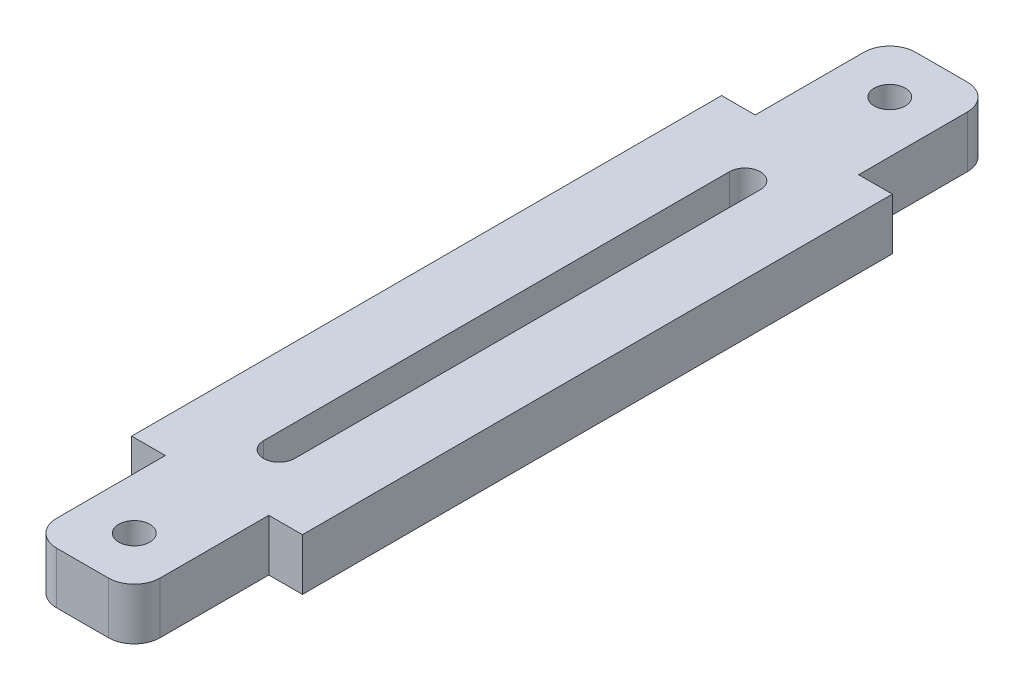
ISO-10303-21;
HEADER;
FILE_DESCRIPTION(('STEP AP214'),'2;1');
FILE_NAME('part.step','',(''),(''),'','','');
FILE_SCHEMA(('AUTOMOTIVE_DESIGN { 1 0 10303 214 1 1 1 1 }'));
ENDSEC;
DATA;
#1=APPLICATION_CONTEXT('core data for automotive mechanical design processes');
#2=APPLICATION_PROTOCOL_DEFINITION('international standard','automotive_design',2000,#1);
#3=PRODUCT_CONTEXT('',#1,'mechanical');
#4=PRODUCT('Part','Part','',(#3));
#5=PRODUCT_RELATED_PRODUCT_CATEGORY('part','',(#4));
#6=PRODUCT_DEFINITION_FORMATION('','',#4);
#7=PRODUCT_DEFINITION_CONTEXT('part definition',#1,'design');
#8=PRODUCT_DEFINITION('design','',#6,#7);
#9=PRODUCT_DEFINITION_SHAPE('','',#8);
#10=(LENGTH_UNIT() NAMED_UNIT(*) SI_UNIT(.MILLI.,.METRE.));
#11=(NAMED_UNIT(*) PLANE_ANGLE_UNIT() SI_UNIT($,.RADIAN.));
#12=(NAMED_UNIT(*) SI_UNIT($,.STERADIAN.) SOLID_ANGLE_UNIT());
#13=UNCERTAINTY_MEASURE_WITH_UNIT(LENGTH_MEASURE(1.E-05),#10,'distance_accuracy_value','');
#14=(GEOMETRIC_REPRESENTATION_CONTEXT(3) GLOBAL_UNCERTAINTY_ASSIGNED_CONTEXT((#13)) GLOBAL_UNIT_ASSIGNED_CONTEXT((#10,
#11,#12)) REPRESENTATION_CONTEXT('',''));
#15=CARTESIAN_POINT('',(0.,0.,0.));
#16=DIRECTION('',(0.,0.,1.));
#17=DIRECTION('',(1.,0.,0.));
#18=AXIS2_PLACEMENT_3D('',#15,#16,#17);
#19=CARTESIAN_POINT('',(0.,5.,0.));
#20=DIRECTION('',(0.,1.,0.));
#21=DIRECTION('',(0.,0.,1.));
#22=AXIS2_PLACEMENT_3D('',#19,#20,#21);
#23=PLANE('',#22);
#24=DIRECTION('',(0.,0.,-1.));
#25=VECTOR('',#24,1.);
#26=CARTESIAN_POINT('',(-1.5,5.,22.5));
#27=LINE('',#26,#25);
#28=CARTESIAN_POINT('',(-1.50000000000001,5.,-22.5));
#29=VERTEX_POINT('',#28);
#30=CARTESIAN_POINT('',(-1.5,5.,22.5));
#31=VERTEX_POINT('',#30);
#32=EDGE_CURVE('E168',#29,#31,#27,.F.);
#33=ORIENTED_EDGE('',*,*,#32,.F.);
#34=CARTESIAN_POINT('',(0.,5.,-22.5));
#35=DIRECTION('',(0.,-1.,0.));
#36=DIRECTION('',(0.,0.,-1.));
#37=AXIS2_PLACEMENT_3D('',#34,#35,#36);
#38=CIRCLE('',#37,1.5);
#39=CARTESIAN_POINT('',(1.49999999999999,5.,-22.5));
#40=VERTEX_POINT('',#39);
#41=EDGE_CURVE('E175',#29,#40,#38,.T.);
#42=ORIENTED_EDGE('',*,*,#41,.T.);
#43=DIRECTION('',(0.,0.,1.));
#44=VECTOR('',#43,1.);
#45=CARTESIAN_POINT('',(1.5,5.,22.5));
#46=LINE('',#45,#44);
#47=CARTESIAN_POINT('',(1.5,5.,22.5));
#48=VERTEX_POINT('',#47);
#49=EDGE_CURVE('E172',#48,#40,#46,.F.);
#50=ORIENTED_EDGE('',*,*,#49,.F.);
#51=CARTESIAN_POINT('',(0.,5.,22.5));
#52=DIRECTION('',(0.,-1.,0.));
#53=DIRECTION('',(0.,0.,-1.));
#54=AXIS2_PLACEMENT_3D('',#51,#52,#53);
#55=CIRCLE('',#54,1.5);
#56=EDGE_CURVE('E259',#48,#31,#55,.T.);
#57=ORIENTED_EDGE('',*,*,#56,.T.);
#58=EDGE_LOOP('',(#33,#42,#50,#57));
#59=FACE_BOUND('',#58,.T.);
#60=CARTESIAN_POINT('',(0.,5.,36.5));
#61=DIRECTION('',(0.,-1.,0.));
#62=DIRECTION('',(0.,0.,-1.));
#63=AXIS2_PLACEMENT_3D('',#60,#61,#62);
#64=CIRCLE('',#63,1.5);
#65=CARTESIAN_POINT('',(0.,5.,35.));
#66=VERTEX_POINT('',#65);
#67=EDGE_CURVE('E171',#66,#66,#64,.T.);
#68=ORIENTED_EDGE('',*,*,#67,.T.);
#69=EDGE_LOOP('',(#68));
#70=FACE_BOUND('',#69,.T.);
#71=DIRECTION('',(0.,0.,1.));
#72=VECTOR('',#71,1.);
#73=CARTESIAN_POINT('',(5.,5.,-41.5));
#74=LINE('',#73,#72);
#75=CARTESIAN_POINT('',(5.,5.,-28.5));
#76=VERTEX_POINT('',#75);
#77=CARTESIAN_POINT('',(5.,5.,-39.));
#78=VERTEX_POINT('',#77);
#79=EDGE_CURVE('E187',#76,#78,#74,.F.);
#80=ORIENTED_EDGE('',*,*,#79,.T.);
#81=CARTESIAN_POINT('',(2.5,5.,-39.));
#82=DIRECTION('',(0.,-1.,0.));
#83=DIRECTION('',(0.,0.,-1.));
#84=AXIS2_PLACEMENT_3D('',#81,#82,#83);
#85=CIRCLE('',#84,2.5);
#86=CARTESIAN_POINT('',(2.5,5.,-41.5));
#87=VERTEX_POINT('',#86);
#88=EDGE_CURVE('E189',#87,#78,#85,.T.);
#89=ORIENTED_EDGE('',*,*,#88,.F.);
#90=DIRECTION('',(1.,0.,0.));
#91=VECTOR('',#90,1.);
#92=CARTESIAN_POINT('',(-4.99999999999999,5.,-41.5));
#93=LINE('',#92,#91);
#94=CARTESIAN_POINT('',(-2.5,5.,-41.5));
#95=VERTEX_POINT('',#94);
#96=EDGE_CURVE('E182',#87,#95,#93,.F.);
#97=ORIENTED_EDGE('',*,*,#96,.T.);
#98=CARTESIAN_POINT('',(-2.5,5.,-39.));
#99=DIRECTION('',(0.,-1.,0.));
#100=DIRECTION('',(0.,0.,-1.));
#101=AXIS2_PLACEMENT_3D('',#98,#99,#100);
#102=CIRCLE('',#101,2.5);
#103=CARTESIAN_POINT('',(-5.,5.,-39.));
#104=VERTEX_POINT('',#103);
#105=EDGE_CURVE('E185',#104,#95,#102,.T.);
#106=ORIENTED_EDGE('',*,*,#105,.F.);
#107=DIRECTION('',(0.,0.,-1.));
#108=VECTOR('',#107,1.);
#109=CARTESIAN_POINT('',(-5.,5.,-28.5));
#110=LINE('',#109,#108);
#111=CARTESIAN_POINT('',(-5.,5.,-28.5));
#112=VERTEX_POINT('',#111);
#113=EDGE_CURVE('E143',#104,#112,#110,.F.);
#114=ORIENTED_EDGE('',*,*,#113,.T.);
#115=DIRECTION('',(1.,0.,0.));
#116=VECTOR('',#115,1.);
#117=CARTESIAN_POINT('',(-5.,5.,-28.5));
#118=LINE('',#117,#116);
#119=CARTESIAN_POINT('',(-8.25,5.,-28.5));
#120=VERTEX_POINT('',#119);
#121=EDGE_CURVE('E137',#112,#120,#118,.F.);
#122=ORIENTED_EDGE('',*,*,#121,.T.);
#123=DIRECTION('',(0.,0.,-1.));
#124=VECTOR('',#123,1.);
#125=CARTESIAN_POINT('',(-8.25,5.,-28.5));
#126=LINE('',#125,#124);
#127=CARTESIAN_POINT('',(-8.25,5.,28.5));
#128=VERTEX_POINT('',#127);
#129=EDGE_CURVE('E141',#120,#128,#126,.F.);
#130=ORIENTED_EDGE('',*,*,#129,.T.);
#131=DIRECTION('',(-1.,0.,0.));
#132=VECTOR('',#131,1.);
#133=CARTESIAN_POINT('',(-8.25,5.,28.5));
#134=LINE('',#133,#132);
#135=CARTESIAN_POINT('',(-5.,5.,28.5));
#136=VERTEX_POINT('',#135);
#137=EDGE_CURVE('E122',#128,#136,#134,.F.);
#138=ORIENTED_EDGE('',*,*,#137,.T.);
#139=DIRECTION('',(0.,0.,-1.));
#140=VECTOR('',#139,1.);
#141=CARTESIAN_POINT('',(-5.,5.,36.5));
#142=LINE('',#141,#140);
#143=CARTESIAN_POINT('',(-5.,5.,39.));
#144=VERTEX_POINT('',#143);
#145=EDGE_CURVE('E221',#136,#144,#142,.F.);
#146=ORIENTED_EDGE('',*,*,#145,.T.);
#147=CARTESIAN_POINT('',(-2.5,5.,39.));
#148=DIRECTION('',(0.,-1.,0.));
#149=DIRECTION('',(0.,0.,-1.));
#150=AXIS2_PLACEMENT_3D('',#147,#148,#149);
#151=CIRCLE('',#150,2.5);
#152=CARTESIAN_POINT('',(-2.5,5.,41.5));
#153=VERTEX_POINT('',#152);
#154=EDGE_CURVE('E112',#153,#144,#151,.T.);
#155=ORIENTED_EDGE('',*,*,#154,.F.);
#156=DIRECTION('',(-1.,0.,0.));
#157=VECTOR('',#156,1.);
#158=CARTESIAN_POINT('',(0.,5.,41.5));
#159=LINE('',#158,#157);
#160=CARTESIAN_POINT('',(2.5,5.,41.5));
#161=VERTEX_POINT('',#160);
#162=EDGE_CURVE('E217',#153,#161,#159,.F.);
#163=ORIENTED_EDGE('',*,*,#162,.T.);
#164=CARTESIAN_POINT('',(2.5,5.,39.));
#165=DIRECTION('',(0.,-1.,0.));
#166=DIRECTION('',(0.,0.,-1.));
#167=AXIS2_PLACEMENT_3D('',#164,#165,#166);
#168=CIRCLE('',#167,2.5);
#169=CARTESIAN_POINT('',(5.,5.,39.));
#170=VERTEX_POINT('',#169);
#171=EDGE_CURVE('E219',#170,#161,#168,.T.);
#172=ORIENTED_EDGE('',*,*,#171,.F.);
#173=DIRECTION('',(0.,0.,1.));
#174=VECTOR('',#173,1.);
#175=CARTESIAN_POINT('',(5.,5.,28.5));
#176=LINE('',#175,#174);
#177=CARTESIAN_POINT('',(5.,5.,28.5));
#178=VERTEX_POINT('',#177);
#179=EDGE_CURVE('E211',#170,#178,#176,.F.);
#180=ORIENTED_EDGE('',*,*,#179,.T.);
#181=DIRECTION('',(-1.,0.,0.));
#182=VECTOR('',#181,1.);
#183=CARTESIAN_POINT('',(8.25,5.,28.5));
#184=LINE('',#183,#182);
#185=CARTESIAN_POINT('',(8.25,5.,28.5));
#186=VERTEX_POINT('',#185);
#187=EDGE_CURVE('E205',#178,#186,#184,.F.);
#188=ORIENTED_EDGE('',*,*,#187,.T.);
#189=DIRECTION('',(0.,0.,1.));
#190=VECTOR('',#189,1.);
#191=CARTESIAN_POINT('',(8.25,5.,-28.5));
#192=LINE('',#191,#190);
#193=CARTESIAN_POINT('',(8.25,5.,-28.5));
#194=VERTEX_POINT('',#193);
#195=EDGE_CURVE('E199',#186,#194,#192,.F.);
#196=ORIENTED_EDGE('',*,*,#195,.T.);
#197=DIRECTION('',(1.,0.,0.));
#198=VECTOR('',#197,1.);
#199=CARTESIAN_POINT('',(5.,5.,-28.5));
#200=LINE('',#199,#198);
#201=EDGE_CURVE('E193',#194,#76,#200,.F.);
#202=ORIENTED_EDGE('',*,*,#201,.T.);
#203=EDGE_LOOP('',(#80,#89,#97,#106,#114,#122,#130,#138,#146,#155,#163,#172,#180,#188,#196,#202));
#204=FACE_BOUND('',#203,.T.);
#205=CARTESIAN_POINT('',(0.,5.,-36.5));
#206=DIRECTION('',(0.,-1.,0.));
#207=DIRECTION('',(0.,0.,-1.));
#208=AXIS2_PLACEMENT_3D('',#205,#206,#207);
#209=CIRCLE('',#208,1.5);
#210=CARTESIAN_POINT('',(0.,5.,-38.));
#211=VERTEX_POINT('',#210);
#212=EDGE_CURVE('E19',#211,#211,#209,.T.);
#213=ORIENTED_EDGE('',*,*,#212,.T.);
#214=EDGE_LOOP('',(#213));
#215=FACE_BOUND('',#214,.T.);
#216=ADVANCED_FACE('F16',(#59,#70,#204,#215),#23,.T.);
#217=CARTESIAN_POINT('',(0.,5.,-36.5));
#218=DIRECTION('',(0.,-1.,0.));
#219=DIRECTION('',(0.,0.,-1.));
#220=AXIS2_PLACEMENT_3D('',#217,#218,#219);
#221=CYLINDRICAL_SURFACE('',#220,1.5);
#222=CARTESIAN_POINT('',(0.,0.,-36.5));
#223=DIRECTION('',(0.,-1.,0.));
#224=DIRECTION('',(0.,0.,-1.));
#225=AXIS2_PLACEMENT_3D('',#222,#223,#224);
#226=CIRCLE('',#225,1.5);
#227=CARTESIAN_POINT('',(0.,0.,-38.));
#228=VERTEX_POINT('',#227);
#229=EDGE_CURVE('E255',#228,#228,#226,.T.);
#230=ORIENTED_EDGE('',*,*,#229,.T.);
#231=EDGE_LOOP('',(#230));
#232=FACE_BOUND('',#231,.T.);
#233=ORIENTED_EDGE('',*,*,#212,.F.);
#234=EDGE_LOOP('',(#233));
#235=FACE_BOUND('',#234,.T.);
#236=ADVANCED_FACE('F616',(#232,#235),#221,.F.);
#237=CARTESIAN_POINT('',(-5.,5.,-28.5));
#238=DIRECTION('',(0.,0.,1.));
#239=DIRECTION('',(1.,0.,0.));
#240=AXIS2_PLACEMENT_3D('',#237,#238,#239);
#241=PLANE('',#240);
#242=DIRECTION('',(0.,1.,0.));
#243=VECTOR('',#242,1.);
#244=CARTESIAN_POINT('',(-8.25,5.,-28.5));
#245=LINE('',#244,#243);
#246=CARTESIAN_POINT('',(-8.25,0.,-28.5));
#247=VERTEX_POINT('',#246);
#248=EDGE_CURVE('E148',#247,#120,#245,.T.);
#249=ORIENTED_EDGE('',*,*,#248,.T.);
#250=ORIENTED_EDGE('',*,*,#121,.F.);
#251=DIRECTION('',(0.,1.,0.));
#252=VECTOR('',#251,1.);
#253=CARTESIAN_POINT('',(-5.,5.,-28.5));
#254=LINE('',#253,#252);
#255=CARTESIAN_POINT('',(-5.,0.,-28.5));
#256=VERTEX_POINT('',#255);
#257=EDGE_CURVE('E298',#112,#256,#254,.F.);
#258=ORIENTED_EDGE('',*,*,#257,.T.);
#259=DIRECTION('',(1.,0.,0.));
#260=VECTOR('',#259,1.);
#261=CARTESIAN_POINT('',(0.,0.,-28.5));
#262=LINE('',#261,#260);
#263=EDGE_CURVE('E160',#256,#247,#262,.F.);
#264=ORIENTED_EDGE('',*,*,#263,.T.);
#265=EDGE_LOOP('',(#249,#250,#258,#264));
#266=FACE_BOUND('',#265,.T.);
#267=ADVANCED_FACE('F158',(#266),#241,.F.);
#268=CARTESIAN_POINT('',(-8.25,5.,-28.5));
#269=DIRECTION('',(1.,0.,0.));
#270=DIRECTION('',(0.,0.,-1.));
#271=AXIS2_PLACEMENT_3D('',#268,#269,#270);
#272=PLANE('',#271);
#273=DIRECTION('',(0.,1.,0.));
#274=VECTOR('',#273,1.);
#275=CARTESIAN_POINT('',(-8.25,5.,28.5));
#276=LINE('',#275,#274);
#277=CARTESIAN_POINT('',(-8.25,0.,28.5));
#278=VERTEX_POINT('',#277);
#279=EDGE_CURVE('E155',#278,#128,#276,.T.);
#280=ORIENTED_EDGE('',*,*,#279,.T.);
#281=ORIENTED_EDGE('',*,*,#129,.F.);
#282=ORIENTED_EDGE('',*,*,#248,.F.);
#283=DIRECTION('',(0.,0.,1.));
#284=VECTOR('',#283,1.);
#285=CARTESIAN_POINT('',(-8.25,0.,0.));
#286=LINE('',#285,#284);
#287=EDGE_CURVE('E285',#247,#278,#286,.T.);
#288=ORIENTED_EDGE('',*,*,#287,.T.);
#289=EDGE_LOOP('',(#280,#281,#282,#288));
#290=FACE_BOUND('',#289,.T.);
#291=ADVANCED_FACE('F152',(#290),#272,.F.);
#292=CARTESIAN_POINT('',(-8.25,5.,28.5));
#293=DIRECTION('',(0.,0.,-1.));
#294=DIRECTION('',(-1.,0.,0.));
#295=AXIS2_PLACEMENT_3D('',#292,#293,#294);
#296=PLANE('',#295);
#297=DIRECTION('',(0.,1.,0.));
#298=VECTOR('',#297,1.);
#299=CARTESIAN_POINT('',(-5.,5.,28.5));
#300=LINE('',#299,#298);
#301=CARTESIAN_POINT('',(-5.,0.,28.5));
#302=VERTEX_POINT('',#301);
#303=EDGE_CURVE('E223',#302,#136,#300,.T.);
#304=ORIENTED_EDGE('',*,*,#303,.T.);
#305=ORIENTED_EDGE('',*,*,#137,.F.);
#306=ORIENTED_EDGE('',*,*,#279,.F.);
#307=DIRECTION('',(1.,0.,0.));
#308=VECTOR('',#307,1.);
#309=CARTESIAN_POINT('',(0.,0.,28.5));
#310=LINE('',#309,#308);
#311=EDGE_CURVE('E282',#278,#302,#310,.T.);
#312=ORIENTED_EDGE('',*,*,#311,.T.);
#313=EDGE_LOOP('',(#304,#305,#306,#312));
#314=FACE_BOUND('',#313,.T.);
#315=ADVANCED_FACE('F592',(#314),#296,.F.);
#316=CARTESIAN_POINT('',(-5.,5.,36.5));
#317=DIRECTION('',(1.,0.,0.));
#318=DIRECTION('',(0.,0.,-1.));
#319=AXIS2_PLACEMENT_3D('',#316,#317,#318);
#320=PLANE('',#319);
#321=DIRECTION('',(0.,-1.,0.));
#322=VECTOR('',#321,1.);
#323=CARTESIAN_POINT('',(-5.,5.,39.));
#324=LINE('',#323,#322);
#325=CARTESIAN_POINT('',(-5.,0.,39.));
#326=VERTEX_POINT('',#325);
#327=EDGE_CURVE('E271',#144,#326,#324,.T.);
#328=ORIENTED_EDGE('',*,*,#327,.F.);
#329=ORIENTED_EDGE('',*,*,#145,.F.);
#330=ORIENTED_EDGE('',*,*,#303,.F.);
#331=DIRECTION('',(0.,0.,1.));
#332=VECTOR('',#331,1.);
#333=CARTESIAN_POINT('',(-5.,0.,0.));
#334=LINE('',#333,#332);
#335=EDGE_CURVE('E254',#302,#326,#334,.T.);
#336=ORIENTED_EDGE('',*,*,#335,.T.);
#337=EDGE_LOOP('',(#328,#329,#330,#336));
#338=FACE_BOUND('',#337,.T.);
#339=ADVANCED_FACE('F584',(#338),#320,.F.);
#340=CARTESIAN_POINT('',(-2.5,5.,39.));
#341=DIRECTION('',(0.,-1.,0.));
#342=DIRECTION('',(0.,0.,-1.));
#343=AXIS2_PLACEMENT_3D('',#340,#341,#342);
#344=CYLINDRICAL_SURFACE('',#343,2.5);
#345=CARTESIAN_POINT('',(-2.5,0.,39.));
#346=DIRECTION('',(0.,-1.,0.));
#347=DIRECTION('',(0.,0.,-1.));
#348=AXIS2_PLACEMENT_3D('',#345,#346,#347);
#349=CIRCLE('',#348,2.5);
#350=CARTESIAN_POINT('',(-2.5,0.,41.5));
#351=VERTEX_POINT('',#350);
#352=EDGE_CURVE('E251',#326,#351,#349,.F.);
#353=ORIENTED_EDGE('',*,*,#352,.T.);
#354=DIRECTION('',(0.,1.,0.));
#355=VECTOR('',#354,1.);
#356=CARTESIAN_POINT('',(-2.5,5.,41.5));
#357=LINE('',#356,#355);
#358=EDGE_CURVE('E220',#351,#153,#357,.T.);
#359=ORIENTED_EDGE('',*,*,#358,.T.);
#360=ORIENTED_EDGE('',*,*,#154,.T.);
#361=ORIENTED_EDGE('',*,*,#327,.T.);
#362=EDGE_LOOP('',(#353,#359,#360,#361));
#363=FACE_BOUND('',#362,.T.);
#364=ADVANCED_FACE('F576',(#363),#344,.T.);
#365=CARTESIAN_POINT('',(0.,5.,41.5));
#366=DIRECTION('',(0.,0.,-1.));
#367=DIRECTION('',(-1.,0.,0.));
#368=AXIS2_PLACEMENT_3D('',#365,#366,#367);
#369=PLANE('',#368);
#370=ORIENTED_EDGE('',*,*,#358,.F.);
#371=DIRECTION('',(1.,0.,0.));
#372=VECTOR('',#371,1.);
#373=CARTESIAN_POINT('',(0.,0.,41.5));
#374=LINE('',#373,#372);
#375=CARTESIAN_POINT('',(2.5,0.,41.5));
#376=VERTEX_POINT('',#375);
#377=EDGE_CURVE('E250',#351,#376,#374,.T.);
#378=ORIENTED_EDGE('',*,*,#377,.T.);
#379=DIRECTION('',(0.,-1.,0.));
#380=VECTOR('',#379,1.);
#381=CARTESIAN_POINT('',(2.5,5.,41.5));
#382=LINE('',#381,#380);
#383=EDGE_CURVE('E270',#161,#376,#382,.T.);
#384=ORIENTED_EDGE('',*,*,#383,.F.);
#385=ORIENTED_EDGE('',*,*,#162,.F.);
#386=EDGE_LOOP('',(#370,#378,#384,#385));
#387=FACE_BOUND('',#386,.T.);
#388=ADVANCED_FACE('F348',(#387),#369,.F.);
#389=CARTESIAN_POINT('',(2.5,5.,39.));
#390=DIRECTION('',(0.,-1.,0.));
#391=DIRECTION('',(0.,0.,-1.));
#392=AXIS2_PLACEMENT_3D('',#389,#390,#391);
#393=CYLINDRICAL_SURFACE('',#392,2.5);
#394=CARTESIAN_POINT('',(2.5,0.,39.));
#395=DIRECTION('',(0.,-1.,0.));
#396=DIRECTION('',(0.,0.,-1.));
#397=AXIS2_PLACEMENT_3D('',#394,#395,#396);
#398=CIRCLE('',#397,2.5);
#399=CARTESIAN_POINT('',(5.,0.,39.));
#400=VERTEX_POINT('',#399);
#401=EDGE_CURVE('E246',#376,#400,#398,.F.);
#402=ORIENTED_EDGE('',*,*,#401,.T.);
#403=DIRECTION('',(0.,1.,0.));
#404=VECTOR('',#403,1.);
#405=CARTESIAN_POINT('',(5.,5.,39.));
#406=LINE('',#405,#404);
#407=EDGE_CURVE('E214',#400,#170,#406,.T.);
#408=ORIENTED_EDGE('',*,*,#407,.T.);
#409=ORIENTED_EDGE('',*,*,#171,.T.);
#410=ORIENTED_EDGE('',*,*,#383,.T.);
#411=EDGE_LOOP('',(#402,#408,#409,#410));
#412=FACE_BOUND('',#411,.T.);
#413=ADVANCED_FACE('F337',(#412),#393,.T.);
#414=CARTESIAN_POINT('',(5.,5.,28.5));
#415=DIRECTION('',(-1.,0.,0.));
#416=DIRECTION('',(0.,0.,1.));
#417=AXIS2_PLACEMENT_3D('',#414,#415,#416);
#418=PLANE('',#417);
#419=ORIENTED_EDGE('',*,*,#407,.F.);
#420=DIRECTION('',(0.,0.,1.));
#421=VECTOR('',#420,1.);
#422=CARTESIAN_POINT('',(5.,0.,0.));
#423=LINE('',#422,#421);
#424=CARTESIAN_POINT('',(5.,0.,28.5));
#425=VERTEX_POINT('',#424);
#426=EDGE_CURVE('E249',#400,#425,#423,.F.);
#427=ORIENTED_EDGE('',*,*,#426,.T.);
#428=DIRECTION('',(0.,1.,0.));
#429=VECTOR('',#428,1.);
#430=CARTESIAN_POINT('',(5.,5.,28.5));
#431=LINE('',#430,#429);
#432=EDGE_CURVE('E208',#425,#178,#431,.T.);
#433=ORIENTED_EDGE('',*,*,#432,.T.);
#434=ORIENTED_EDGE('',*,*,#179,.F.);
#435=EDGE_LOOP('',(#419,#427,#433,#434));
#436=FACE_BOUND('',#435,.T.);
#437=ADVANCED_FACE('F383',(#436),#418,.F.);
#438=CARTESIAN_POINT('',(8.25,5.,28.5));
#439=DIRECTION('',(0.,0.,-1.));
#440=DIRECTION('',(-1.,0.,0.));
#441=AXIS2_PLACEMENT_3D('',#438,#439,#440);
#442=PLANE('',#441);
#443=DIRECTION('',(0.,1.,0.));
#444=VECTOR('',#443,1.);
#445=CARTESIAN_POINT('',(8.25,5.,28.5));
#446=LINE('',#445,#444);
#447=CARTESIAN_POINT('',(8.25,0.,28.5));
#448=VERTEX_POINT('',#447);
#449=EDGE_CURVE('E202',#448,#186,#446,.T.);
#450=ORIENTED_EDGE('',*,*,#449,.T.);
#451=ORIENTED_EDGE('',*,*,#187,.F.);
#452=ORIENTED_EDGE('',*,*,#432,.F.);
#453=DIRECTION('',(1.,0.,0.));
#454=VECTOR('',#453,1.);
#455=CARTESIAN_POINT('',(0.,0.,28.5));
#456=LINE('',#455,#454);
#457=EDGE_CURVE('E318',#425,#448,#456,.T.);
#458=ORIENTED_EDGE('',*,*,#457,.T.);
#459=EDGE_LOOP('',(#450,#451,#452,#458));
#460=FACE_BOUND('',#459,.T.);
#461=ADVANCED_FACE('F417',(#460),#442,.F.);
#462=CARTESIAN_POINT('',(8.25,5.,-28.5));
#463=DIRECTION('',(-1.,0.,0.));
#464=DIRECTION('',(0.,0.,1.));
#465=AXIS2_PLACEMENT_3D('',#462,#463,#464);
#466=PLANE('',#465);
#467=DIRECTION('',(0.,1.,0.));
#468=VECTOR('',#467,1.);
#469=CARTESIAN_POINT('',(8.25,5.,-28.5));
#470=LINE('',#469,#468);
#471=CARTESIAN_POINT('',(8.25,0.,-28.5));
#472=VERTEX_POINT('',#471);
#473=EDGE_CURVE('E196',#472,#194,#470,.T.);
#474=ORIENTED_EDGE('',*,*,#473,.T.);
#475=ORIENTED_EDGE('',*,*,#195,.F.);
#476=ORIENTED_EDGE('',*,*,#449,.F.);
#477=DIRECTION('',(0.,0.,1.));
#478=VECTOR('',#477,1.);
#479=CARTESIAN_POINT('',(8.25,0.,0.));
#480=LINE('',#479,#478);
#481=EDGE_CURVE('E309',#448,#472,#480,.F.);
#482=ORIENTED_EDGE('',*,*,#481,.T.);
#483=EDGE_LOOP('',(#474,#475,#476,#482));
#484=FACE_BOUND('',#483,.T.);
#485=ADVANCED_FACE('F416',(#484),#466,.F.);
#486=CARTESIAN_POINT('',(5.,5.,-28.5));
#487=DIRECTION('',(0.,0.,1.));
#488=DIRECTION('',(1.,0.,0.));
#489=AXIS2_PLACEMENT_3D('',#486,#487,#488);
#490=PLANE('',#489);
#491=DIRECTION('',(0.,1.,0.));
#492=VECTOR('',#491,1.);
#493=CARTESIAN_POINT('',(5.,5.,-28.5));
#494=LINE('',#493,#492);
#495=CARTESIAN_POINT('',(5.,0.,-28.5));
#496=VERTEX_POINT('',#495);
#497=EDGE_CURVE('E190',#496,#76,#494,.T.);
#498=ORIENTED_EDGE('',*,*,#497,.T.);
#499=ORIENTED_EDGE('',*,*,#201,.F.);
#500=ORIENTED_EDGE('',*,*,#473,.F.);
#501=DIRECTION('',(1.,0.,0.));
#502=VECTOR('',#501,1.);
#503=CARTESIAN_POINT('',(0.,0.,-28.5));
#504=LINE('',#503,#502);
#505=EDGE_CURVE('E306',#472,#496,#504,.F.);
#506=ORIENTED_EDGE('',*,*,#505,.T.);
#507=EDGE_LOOP('',(#498,#499,#500,#506));
#508=FACE_BOUND('',#507,.T.);
#509=ADVANCED_FACE('F414',(#508),#490,.F.);
#510=CARTESIAN_POINT('',(5.,5.,-41.5));
#511=DIRECTION('',(-1.,0.,0.));
#512=DIRECTION('',(0.,0.,1.));
#513=AXIS2_PLACEMENT_3D('',#510,#511,#512);
#514=PLANE('',#513);
#515=DIRECTION('',(0.,-1.,0.));
#516=VECTOR('',#515,1.);
#517=CARTESIAN_POINT('',(5.00000000000001,5.,-39.));
#518=LINE('',#517,#516);
#519=CARTESIAN_POINT('',(5.,0.,-39.));
#520=VERTEX_POINT('',#519);
#521=EDGE_CURVE('E269',#78,#520,#518,.T.);
#522=ORIENTED_EDGE('',*,*,#521,.F.);
#523=ORIENTED_EDGE('',*,*,#79,.F.);
#524=ORIENTED_EDGE('',*,*,#497,.F.);
#525=DIRECTION('',(0.,0.,1.));
#526=VECTOR('',#525,1.);
#527=CARTESIAN_POINT('',(5.,0.,0.));
#528=LINE('',#527,#526);
#529=EDGE_CURVE('E245',#496,#520,#528,.F.);
#530=ORIENTED_EDGE('',*,*,#529,.T.);
#531=EDGE_LOOP('',(#522,#523,#524,#530));
#532=FACE_BOUND('',#531,.T.);
#533=ADVANCED_FACE('F408',(#532),#514,.F.);
#534=CARTESIAN_POINT('',(2.5,5.,-39.));
#535=DIRECTION('',(0.,-1.,0.));
#536=DIRECTION('',(0.,0.,-1.));
#537=AXIS2_PLACEMENT_3D('',#534,#535,#536);
#538=CYLINDRICAL_SURFACE('',#537,2.5);
#539=CARTESIAN_POINT('',(2.5,0.,-39.));
#540=DIRECTION('',(0.,-1.,0.));
#541=DIRECTION('',(0.,0.,-1.));
#542=AXIS2_PLACEMENT_3D('',#539,#540,#541);
#543=CIRCLE('',#542,2.5);
#544=CARTESIAN_POINT('',(2.5,0.,-41.5));
#545=VERTEX_POINT('',#544);
#546=EDGE_CURVE('E242',#520,#545,#543,.F.);
#547=ORIENTED_EDGE('',*,*,#546,.T.);
#548=DIRECTION('',(0.,1.,0.));
#549=VECTOR('',#548,1.);
#550=CARTESIAN_POINT('',(2.5,5.,-41.5));
#551=LINE('',#550,#549);
#552=EDGE_CURVE('E186',#545,#87,#551,.T.);
#553=ORIENTED_EDGE('',*,*,#552,.T.);
#554=ORIENTED_EDGE('',*,*,#88,.T.);
#555=ORIENTED_EDGE('',*,*,#521,.T.);
#556=EDGE_LOOP('',(#547,#553,#554,#555));
#557=FACE_BOUND('',#556,.T.);
#558=ADVANCED_FACE('F463',(#557),#538,.T.);
#559=CARTESIAN_POINT('',(-4.99999999999999,5.,-41.5));
#560=DIRECTION('',(0.,0.,1.));
#561=DIRECTION('',(1.,0.,0.));
#562=AXIS2_PLACEMENT_3D('',#559,#560,#561);
#563=PLANE('',#562);
#564=DIRECTION('',(0.,-1.,0.));
#565=VECTOR('',#564,1.);
#566=CARTESIAN_POINT('',(-2.5,5.,-41.5));
#567=LINE('',#566,#565);
#568=CARTESIAN_POINT('',(-2.5,0.,-41.5));
#569=VERTEX_POINT('',#568);
#570=EDGE_CURVE('E267',#95,#569,#567,.T.);
#571=ORIENTED_EDGE('',*,*,#570,.F.);
#572=ORIENTED_EDGE('',*,*,#96,.F.);
#573=ORIENTED_EDGE('',*,*,#552,.F.);
#574=DIRECTION('',(1.,0.,0.));
#575=VECTOR('',#574,1.);
#576=CARTESIAN_POINT('',(0.,0.,-41.5));
#577=LINE('',#576,#575);
#578=EDGE_CURVE('E241',#545,#569,#577,.F.);
#579=ORIENTED_EDGE('',*,*,#578,.T.);
#580=EDGE_LOOP('',(#571,#572,#573,#579));
#581=FACE_BOUND('',#580,.T.);
#582=ADVANCED_FACE('F459',(#581),#563,.F.);
#583=CARTESIAN_POINT('',(-2.5,5.,-39.));
#584=DIRECTION('',(0.,-1.,0.));
#585=DIRECTION('',(0.,0.,-1.));
#586=AXIS2_PLACEMENT_3D('',#583,#584,#585);
#587=CYLINDRICAL_SURFACE('',#586,2.5);
#588=CARTESIAN_POINT('',(-2.5,0.,-39.));
#589=DIRECTION('',(0.,-1.,0.));
#590=DIRECTION('',(0.,0.,-1.));
#591=AXIS2_PLACEMENT_3D('',#588,#589,#590);
#592=CIRCLE('',#591,2.5);
#593=CARTESIAN_POINT('',(-5.,0.,-39.));
#594=VERTEX_POINT('',#593);
#595=EDGE_CURVE('E238',#569,#594,#592,.F.);
#596=ORIENTED_EDGE('',*,*,#595,.T.);
#597=DIRECTION('',(0.,1.,0.));
#598=VECTOR('',#597,1.);
#599=CARTESIAN_POINT('',(-5.,5.,-39.));
#600=LINE('',#599,#598);
#601=EDGE_CURVE('E177',#594,#104,#600,.T.);
#602=ORIENTED_EDGE('',*,*,#601,.T.);
#603=ORIENTED_EDGE('',*,*,#105,.T.);
#604=ORIENTED_EDGE('',*,*,#570,.T.);
#605=EDGE_LOOP('',(#596,#602,#603,#604));
#606=FACE_BOUND('',#605,.T.);
#607=ADVANCED_FACE('F456',(#606),#587,.T.);
#608=CARTESIAN_POINT('',(-5.,5.,-28.5));
#609=DIRECTION('',(1.,0.,0.));
#610=DIRECTION('',(0.,0.,-1.));
#611=AXIS2_PLACEMENT_3D('',#608,#609,#610);
#612=PLANE('',#611);
#613=ORIENTED_EDGE('',*,*,#601,.F.);
#614=DIRECTION('',(0.,0.,1.));
#615=VECTOR('',#614,1.);
#616=CARTESIAN_POINT('',(-5.,0.,0.));
#617=LINE('',#616,#615);
#618=EDGE_CURVE('E237',#594,#256,#617,.T.);
#619=ORIENTED_EDGE('',*,*,#618,.T.);
#620=ORIENTED_EDGE('',*,*,#257,.F.);
#621=ORIENTED_EDGE('',*,*,#113,.F.);
#622=EDGE_LOOP('',(#613,#619,#620,#621));
#623=FACE_BOUND('',#622,.T.);
#624=ADVANCED_FACE('F370',(#623),#612,.F.);
#625=CARTESIAN_POINT('',(0.,5.,36.5));
#626=DIRECTION('',(0.,-1.,0.));
#627=DIRECTION('',(0.,0.,-1.));
#628=AXIS2_PLACEMENT_3D('',#625,#626,#627);
#629=CYLINDRICAL_SURFACE('',#628,1.5);
#630=CARTESIAN_POINT('',(0.,0.,36.5));
#631=DIRECTION('',(0.,-1.,0.));
#632=DIRECTION('',(0.,0.,-1.));
#633=AXIS2_PLACEMENT_3D('',#630,#631,#632);
#634=CIRCLE('',#633,1.5);
#635=CARTESIAN_POINT('',(0.,0.,35.));
#636=VERTEX_POINT('',#635);
#637=EDGE_CURVE('E234',#636,#636,#634,.T.);
#638=ORIENTED_EDGE('',*,*,#637,.T.);
#639=EDGE_LOOP('',(#638));
#640=FACE_BOUND('',#639,.T.);
#641=ORIENTED_EDGE('',*,*,#67,.F.);
#642=EDGE_LOOP('',(#641));
#643=FACE_BOUND('',#642,.T.);
#644=ADVANCED_FACE('F449',(#640,#643),#629,.F.);
#645=CARTESIAN_POINT('',(-1.5,5.,22.5));
#646=DIRECTION('',(1.,0.,0.));
#647=DIRECTION('',(0.,0.,-1.));
#648=AXIS2_PLACEMENT_3D('',#645,#646,#647);
#649=PLANE('',#648);
#650=ORIENTED_EDGE('',*,*,#32,.T.);
#651=DIRECTION('',(0.,-1.,0.));
#652=VECTOR('',#651,1.);
#653=CARTESIAN_POINT('',(-1.5,5.,22.5));
#654=LINE('',#653,#652);
#655=CARTESIAN_POINT('',(-1.5,0.,22.5));
#656=VERTEX_POINT('',#655);
#657=EDGE_CURVE('E258',#31,#656,#654,.T.);
#658=ORIENTED_EDGE('',*,*,#657,.T.);
#659=DIRECTION('',(0.,0.,1.));
#660=VECTOR('',#659,1.);
#661=CARTESIAN_POINT('',(-1.5,0.,0.));
#662=LINE('',#661,#660);
#663=CARTESIAN_POINT('',(-1.5,0.,-22.5));
#664=VERTEX_POINT('',#663);
#665=EDGE_CURVE('E233',#656,#664,#662,.F.);
#666=ORIENTED_EDGE('',*,*,#665,.T.);
#667=DIRECTION('',(0.,-1.,0.));
#668=VECTOR('',#667,1.);
#669=CARTESIAN_POINT('',(-1.50000000000001,5.,-22.5));
#670=LINE('',#669,#668);
#671=EDGE_CURVE('E170',#664,#29,#670,.F.);
#672=ORIENTED_EDGE('',*,*,#671,.T.);
#673=EDGE_LOOP('',(#650,#658,#666,#672));
#674=FACE_BOUND('',#673,.T.);
#675=ADVANCED_FACE('F445',(#674),#649,.T.);
#676=CARTESIAN_POINT('',(0.,5.,-22.5));
#677=DIRECTION('',(0.,-1.,0.));
#678=DIRECTION('',(0.,0.,-1.));
#679=AXIS2_PLACEMENT_3D('',#676,#677,#678);
#680=CYLINDRICAL_SURFACE('',#679,1.5);
#681=ORIENTED_EDGE('',*,*,#41,.F.);
#682=ORIENTED_EDGE('',*,*,#671,.F.);
#683=CARTESIAN_POINT('',(0.,0.,-22.5));
#684=DIRECTION('',(0.,-1.,0.));
#685=DIRECTION('',(0.,0.,-1.));
#686=AXIS2_PLACEMENT_3D('',#683,#684,#685);
#687=CIRCLE('',#686,1.5);
#688=CARTESIAN_POINT('',(1.49999999999999,0.,-22.5));
#689=VERTEX_POINT('',#688);
#690=EDGE_CURVE('E231',#664,#689,#687,.T.);
#691=ORIENTED_EDGE('',*,*,#690,.T.);
#692=DIRECTION('',(0.,1.,0.));
#693=VECTOR('',#692,1.);
#694=CARTESIAN_POINT('',(1.49999999999999,5.,-22.5));
#695=LINE('',#694,#693);
#696=EDGE_CURVE('E174',#40,#689,#695,.F.);
#697=ORIENTED_EDGE('',*,*,#696,.F.);
#698=EDGE_LOOP('',(#681,#682,#691,#697));
#699=FACE_BOUND('',#698,.T.);
#700=ADVANCED_FACE('F441',(#699),#680,.F.);
#701=CARTESIAN_POINT('',(1.5,5.,22.5));
#702=DIRECTION('',(-1.,0.,0.));
#703=DIRECTION('',(0.,0.,1.));
#704=AXIS2_PLACEMENT_3D('',#701,#702,#703);
#705=PLANE('',#704);
#706=ORIENTED_EDGE('',*,*,#49,.T.);
#707=ORIENTED_EDGE('',*,*,#696,.T.);
#708=DIRECTION('',(0.,0.,1.));
#709=VECTOR('',#708,1.);
#710=CARTESIAN_POINT('',(1.49999999999999,0.,0.));
#711=LINE('',#710,#709);
#712=CARTESIAN_POINT('',(1.5,0.,22.5));
#713=VERTEX_POINT('',#712);
#714=EDGE_CURVE('E25',#689,#713,#711,.T.);
#715=ORIENTED_EDGE('',*,*,#714,.T.);
#716=DIRECTION('',(0.,-1.,0.));
#717=VECTOR('',#716,1.);
#718=CARTESIAN_POINT('',(1.5,5.,22.5));
#719=LINE('',#718,#717);
#720=EDGE_CURVE('E33',#713,#48,#719,.F.);
#721=ORIENTED_EDGE('',*,*,#720,.T.);
#722=EDGE_LOOP('',(#706,#707,#715,#721));
#723=FACE_BOUND('',#722,.T.);
#724=ADVANCED_FACE('F434',(#723),#705,.T.);
#725=CARTESIAN_POINT('',(0.,5.,22.5));
#726=DIRECTION('',(0.,-1.,0.));
#727=DIRECTION('',(0.,0.,-1.));
#728=AXIS2_PLACEMENT_3D('',#725,#726,#727);
#729=CYLINDRICAL_SURFACE('',#728,1.5);
#730=ORIENTED_EDGE('',*,*,#657,.F.);
#731=ORIENTED_EDGE('',*,*,#56,.F.);
#732=ORIENTED_EDGE('',*,*,#720,.F.);
#733=CARTESIAN_POINT('',(0.,0.,22.5));
#734=DIRECTION('',(0.,-1.,0.));
#735=DIRECTION('',(0.,0.,-1.));
#736=AXIS2_PLACEMENT_3D('',#733,#734,#735);
#737=CIRCLE('',#736,1.5);
#738=EDGE_CURVE('E11',#713,#656,#737,.T.);
#739=ORIENTED_EDGE('',*,*,#738,.T.);
#740=EDGE_LOOP('',(#730,#731,#732,#739));
#741=FACE_BOUND('',#740,.T.);
#742=ADVANCED_FACE('F428',(#741),#729,.F.);
#743=CARTESIAN_POINT('',(0.,0.,0.));
#744=DIRECTION('',(0.,1.,0.));
#745=DIRECTION('',(0.,0.,1.));
#746=AXIS2_PLACEMENT_3D('',#743,#744,#745);
#747=PLANE('',#746);
#748=ORIENTED_EDGE('',*,*,#714,.F.);
#749=ORIENTED_EDGE('',*,*,#690,.F.);
#750=ORIENTED_EDGE('',*,*,#665,.F.);
#751=ORIENTED_EDGE('',*,*,#738,.F.);
#752=EDGE_LOOP('',(#748,#749,#750,#751));
#753=FACE_BOUND('',#752,.T.);
#754=ORIENTED_EDGE('',*,*,#637,.F.);
#755=EDGE_LOOP('',(#754));
#756=FACE_BOUND('',#755,.T.);
#757=ORIENTED_EDGE('',*,*,#595,.F.);
#758=ORIENTED_EDGE('',*,*,#578,.F.);
#759=ORIENTED_EDGE('',*,*,#546,.F.);
#760=ORIENTED_EDGE('',*,*,#529,.F.);
#761=ORIENTED_EDGE('',*,*,#505,.F.);
#762=ORIENTED_EDGE('',*,*,#481,.F.);
#763=ORIENTED_EDGE('',*,*,#457,.F.);
#764=ORIENTED_EDGE('',*,*,#426,.F.);
#765=ORIENTED_EDGE('',*,*,#401,.F.);
#766=ORIENTED_EDGE('',*,*,#377,.F.);
#767=ORIENTED_EDGE('',*,*,#352,.F.);
#768=ORIENTED_EDGE('',*,*,#335,.F.);
#769=ORIENTED_EDGE('',*,*,#311,.F.);
#770=ORIENTED_EDGE('',*,*,#287,.F.);
#771=ORIENTED_EDGE('',*,*,#263,.F.);
#772=ORIENTED_EDGE('',*,*,#618,.F.);
#773=EDGE_LOOP('',(#757,#758,#759,#760,#761,#762,#763,#764,#765,#766,#767,#768,#769,#770,#771,#772));
#774=FACE_BOUND('',#773,.T.);
#775=ORIENTED_EDGE('',*,*,#229,.F.);
#776=EDGE_LOOP('',(#775));
#777=FACE_BOUND('',#776,.T.);
#778=ADVANCED_FACE('F344',(#753,#756,#774,#777),#747,.F.);
#779=CLOSED_SHELL('',(#216,#236,#267,#291,#315,#339,#364,#388,#413,#437,#461,#485,#509,#533,
#558,#582,#607,#624,#644,#675,#700,#724,#742,#778));
#780=MANIFOLD_SOLID_BREP('B1',#779);
#781=ADVANCED_BREP_SHAPE_REPRESENTATION('',(#18,#780),#14);
#782=SHAPE_DEFINITION_REPRESENTATION(#9,#781);
ENDSEC;
END-ISO-10303-21;
